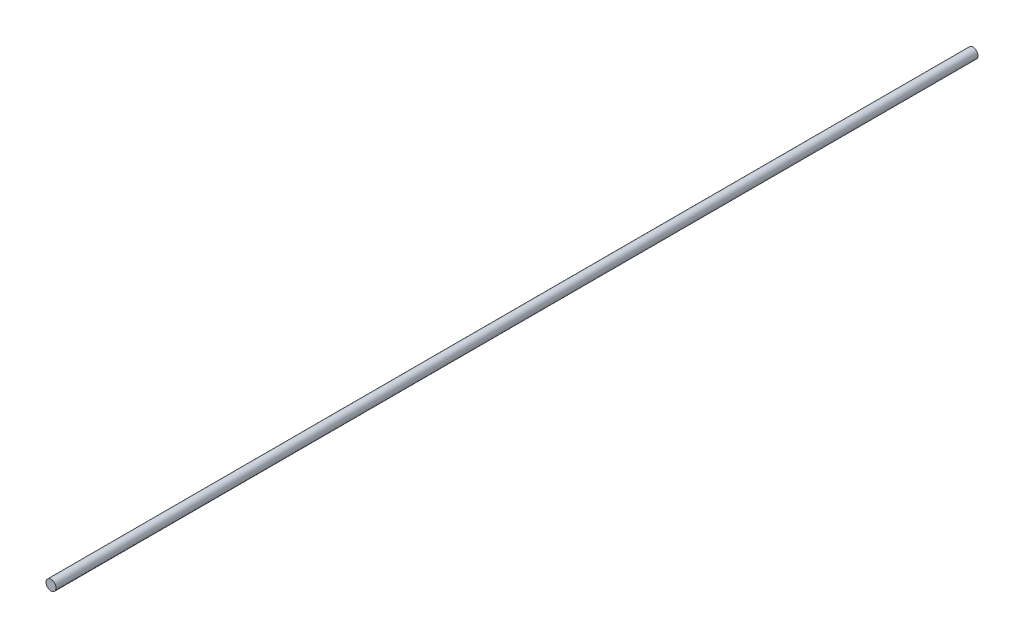
ISO-10303-21;
HEADER;
FILE_DESCRIPTION(('STEP AP214'),'2;1');
FILE_NAME('part.step','',(''),(''),'','','');
FILE_SCHEMA(('AUTOMOTIVE_DESIGN { 1 0 10303 214 1 1 1 1 }'));
ENDSEC;
DATA;
#1=APPLICATION_CONTEXT('core data for automotive mechanical design processes');
#2=APPLICATION_PROTOCOL_DEFINITION('international standard','automotive_design',2000,#1);
#3=PRODUCT_CONTEXT('',#1,'mechanical');
#4=PRODUCT('Part','Part','',(#3));
#5=PRODUCT_RELATED_PRODUCT_CATEGORY('part','',(#4));
#6=PRODUCT_DEFINITION_FORMATION('','',#4);
#7=PRODUCT_DEFINITION_CONTEXT('part definition',#1,'design');
#8=PRODUCT_DEFINITION('design','',#6,#7);
#9=PRODUCT_DEFINITION_SHAPE('','',#8);
#10=(LENGTH_UNIT() NAMED_UNIT(*) SI_UNIT(.MILLI.,.METRE.));
#11=(NAMED_UNIT(*) PLANE_ANGLE_UNIT() SI_UNIT($,.RADIAN.));
#12=(NAMED_UNIT(*) SI_UNIT($,.STERADIAN.) SOLID_ANGLE_UNIT());
#13=UNCERTAINTY_MEASURE_WITH_UNIT(LENGTH_MEASURE(1.E-05),#10,'distance_accuracy_value','');
#14=(GEOMETRIC_REPRESENTATION_CONTEXT(3) GLOBAL_UNCERTAINTY_ASSIGNED_CONTEXT((#13)) GLOBAL_UNIT_ASSIGNED_CONTEXT((#10,
#11,#12)) REPRESENTATION_CONTEXT('',''));
#15=CARTESIAN_POINT('',(0.,0.,0.));
#16=DIRECTION('',(0.,0.,1.));
#17=DIRECTION('',(1.,0.,0.));
#18=AXIS2_PLACEMENT_3D('',#15,#16,#17);
#19=CARTESIAN_POINT('',(0.,0.,367.604406937675));
#20=DIRECTION('',(0.,0.,-1.));
#21=DIRECTION('',(-1.,0.,0.));
#22=AXIS2_PLACEMENT_3D('',#19,#20,#21);
#23=CYLINDRICAL_SURFACE('',#22,2.);
#24=CARTESIAN_POINT('',(0.,0.,367.604406937675));
#25=DIRECTION('',(0.,0.,1.));
#26=DIRECTION('',(1.,0.,0.));
#27=AXIS2_PLACEMENT_3D('',#24,#25,#26);
#28=CIRCLE('',#27,2.);
#29=CARTESIAN_POINT('',(2.,0.,367.604406937675));
#30=VERTEX_POINT('',#29);
#31=EDGE_CURVE('E10',#30,#30,#28,.T.);
#32=ORIENTED_EDGE('',*,*,#31,.F.);
#33=EDGE_LOOP('',(#32));
#34=FACE_BOUND('',#33,.T.);
#35=CARTESIAN_POINT('',(0.,0.,0.));
#36=DIRECTION('',(0.,0.,1.));
#37=DIRECTION('',(1.,0.,0.));
#38=AXIS2_PLACEMENT_3D('',#35,#36,#37);
#39=CIRCLE('',#38,2.);
#40=CARTESIAN_POINT('',(2.,0.,0.));
#41=VERTEX_POINT('',#40);
#42=EDGE_CURVE('E40',#41,#41,#39,.T.);
#43=ORIENTED_EDGE('',*,*,#42,.T.);
#44=EDGE_LOOP('',(#43));
#45=FACE_BOUND('',#44,.T.);
#46=ADVANCED_FACE('F37',(#34,#45),#23,.T.);
#47=CARTESIAN_POINT('',(0.,0.,367.604406937675));
#48=DIRECTION('',(0.,0.,1.));
#49=DIRECTION('',(1.,0.,0.));
#50=AXIS2_PLACEMENT_3D('',#47,#48,#49);
#51=PLANE('',#50);
#52=ORIENTED_EDGE('',*,*,#31,.T.);
#53=EDGE_LOOP('',(#52));
#54=FACE_BOUND('',#53,.T.);
#55=ADVANCED_FACE('F52',(#54),#51,.T.);
#56=CARTESIAN_POINT('',(0.,0.,0.));
#57=DIRECTION('',(0.,0.,1.));
#58=DIRECTION('',(1.,0.,0.));
#59=AXIS2_PLACEMENT_3D('',#56,#57,#58);
#60=PLANE('',#59);
#61=ORIENTED_EDGE('',*,*,#42,.F.);
#62=EDGE_LOOP('',(#61));
#63=FACE_BOUND('',#62,.T.);
#64=ADVANCED_FACE('F50',(#63),#60,.F.);
#65=CLOSED_SHELL('',(#46,#55,#64));
#66=MANIFOLD_SOLID_BREP('B2',#65);
#67=ADVANCED_BREP_SHAPE_REPRESENTATION('',(#18,#66),#14);
#68=SHAPE_DEFINITION_REPRESENTATION(#9,#67);
ENDSEC;
END-ISO-10303-21;
